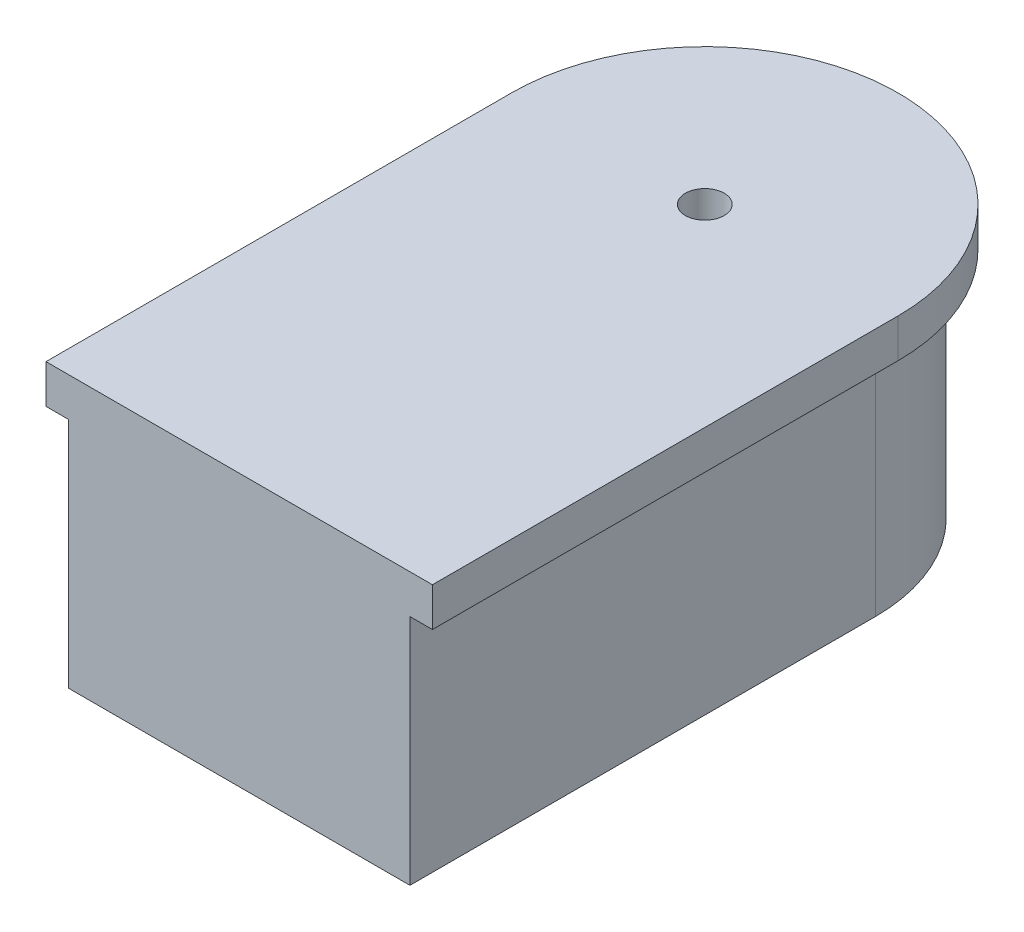
ISO-10303-21;
HEADER;
FILE_DESCRIPTION(('STEP AP214'),'2;1');
FILE_NAME('part.step','',(''),(''),'','','');
FILE_SCHEMA(('AUTOMOTIVE_DESIGN { 1 0 10303 214 1 1 1 1 }'));
ENDSEC;
DATA;
#1=APPLICATION_CONTEXT('core data for automotive mechanical design processes');
#2=APPLICATION_PROTOCOL_DEFINITION('international standard','automotive_design',2000,#1);
#3=PRODUCT_CONTEXT('',#1,'mechanical');
#4=PRODUCT('Part','Part','',(#3));
#5=PRODUCT_RELATED_PRODUCT_CATEGORY('part','',(#4));
#6=PRODUCT_DEFINITION_FORMATION('','',#4);
#7=PRODUCT_DEFINITION_CONTEXT('part definition',#1,'design');
#8=PRODUCT_DEFINITION('design','',#6,#7);
#9=PRODUCT_DEFINITION_SHAPE('','',#8);
#10=(LENGTH_UNIT() NAMED_UNIT(*) SI_UNIT(.MILLI.,.METRE.));
#11=(NAMED_UNIT(*) PLANE_ANGLE_UNIT() SI_UNIT($,.RADIAN.));
#12=(NAMED_UNIT(*) SI_UNIT($,.STERADIAN.) SOLID_ANGLE_UNIT());
#13=UNCERTAINTY_MEASURE_WITH_UNIT(LENGTH_MEASURE(1.E-05),#10,'distance_accuracy_value','');
#14=(GEOMETRIC_REPRESENTATION_CONTEXT(3) GLOBAL_UNCERTAINTY_ASSIGNED_CONTEXT((#13)) GLOBAL_UNIT_ASSIGNED_CONTEXT((#10,
#11,#12)) REPRESENTATION_CONTEXT('',''));
#15=CARTESIAN_POINT('',(0.,0.,0.));
#16=DIRECTION('',(0.,0.,1.));
#17=DIRECTION('',(1.,0.,0.));
#18=AXIS2_PLACEMENT_3D('',#15,#16,#17);
#19=CARTESIAN_POINT('',(0.,30.,0.));
#20=DIRECTION('',(1.,0.,0.));
#21=DIRECTION('',(0.,0.,-1.));
#22=AXIS2_PLACEMENT_3D('',#19,#20,#21);
#23=PLANE('',#22);
#24=DIRECTION('',(0.,0.,1.));
#25=VECTOR('',#24,1.);
#26=CARTESIAN_POINT('',(0.,0.,0.));
#27=LINE('',#26,#25);
#28=CARTESIAN_POINT('',(0.,0.,-60.));
#29=VERTEX_POINT('',#28);
#30=CARTESIAN_POINT('',(0.,0.,0.));
#31=VERTEX_POINT('',#30);
#32=EDGE_CURVE('E130',#29,#31,#27,.T.);
#33=ORIENTED_EDGE('',*,*,#32,.T.);
#34=DIRECTION('',(0.,-1.,0.));
#35=VECTOR('',#34,1.);
#36=CARTESIAN_POINT('',(0.,30.,0.));
#37=LINE('',#36,#35);
#38=CARTESIAN_POINT('',(0.,30.,0.));
#39=VERTEX_POINT('',#38);
#40=EDGE_CURVE('E11',#39,#31,#37,.T.);
#41=ORIENTED_EDGE('',*,*,#40,.F.);
#42=DIRECTION('',(0.,0.,1.));
#43=VECTOR('',#42,1.);
#44=CARTESIAN_POINT('',(0.,30.,0.));
#45=LINE('',#44,#43);
#46=CARTESIAN_POINT('',(0.,30.,-60.));
#47=VERTEX_POINT('',#46);
#48=EDGE_CURVE('E138',#47,#39,#45,.T.);
#49=ORIENTED_EDGE('',*,*,#48,.F.);
#50=DIRECTION('',(0.,-1.,0.));
#51=VECTOR('',#50,1.);
#52=CARTESIAN_POINT('',(0.,30.,-60.));
#53=LINE('',#52,#51);
#54=EDGE_CURVE('E145',#47,#29,#53,.T.);
#55=ORIENTED_EDGE('',*,*,#54,.T.);
#56=EDGE_LOOP('',(#33,#41,#49,#55));
#57=FACE_BOUND('',#56,.T.);
#58=ADVANCED_FACE('F33',(#57),#23,.F.);
#59=CARTESIAN_POINT('',(0.,30.,0.));
#60=DIRECTION('',(0.,0.,-1.));
#61=DIRECTION('',(-1.,0.,0.));
#62=AXIS2_PLACEMENT_3D('',#59,#60,#61);
#63=PLANE('',#62);
#64=DIRECTION('',(1.,0.,0.));
#65=VECTOR('',#64,1.);
#66=CARTESIAN_POINT('',(0.,0.,0.));
#67=LINE('',#66,#65);
#68=CARTESIAN_POINT('',(44.,0.,0.));
#69=VERTEX_POINT('',#68);
#70=EDGE_CURVE('E132',#31,#69,#67,.T.);
#71=ORIENTED_EDGE('',*,*,#70,.T.);
#72=DIRECTION('',(0.,-1.,0.));
#73=VECTOR('',#72,1.);
#74=CARTESIAN_POINT('',(44.,30.,0.));
#75=LINE('',#74,#73);
#76=CARTESIAN_POINT('',(44.,30.,0.));
#77=VERTEX_POINT('',#76);
#78=EDGE_CURVE('E41',#77,#69,#75,.T.);
#79=ORIENTED_EDGE('',*,*,#78,.F.);
#80=DIRECTION('',(1.,0.,0.));
#81=VECTOR('',#80,1.);
#82=CARTESIAN_POINT('',(46.9,30.,0.));
#83=LINE('',#82,#81);
#84=CARTESIAN_POINT('',(46.9,30.,0.));
#85=VERTEX_POINT('',#84);
#86=EDGE_CURVE('E162',#77,#85,#83,.T.);
#87=ORIENTED_EDGE('',*,*,#86,.T.);
#88=DIRECTION('',(0.,-1.,0.));
#89=VECTOR('',#88,1.);
#90=CARTESIAN_POINT('',(46.9,35.,0.));
#91=LINE('',#90,#89);
#92=CARTESIAN_POINT('',(46.9,35.,0.));
#93=VERTEX_POINT('',#92);
#94=EDGE_CURVE('E169',#93,#85,#91,.T.);
#95=ORIENTED_EDGE('',*,*,#94,.F.);
#96=DIRECTION('',(1.,0.,0.));
#97=VECTOR('',#96,1.);
#98=CARTESIAN_POINT('',(46.9,35.,0.));
#99=LINE('',#98,#97);
#100=CARTESIAN_POINT('',(-2.89999999999999,35.,0.));
#101=VERTEX_POINT('',#100);
#102=EDGE_CURVE('E121',#101,#93,#99,.T.);
#103=ORIENTED_EDGE('',*,*,#102,.F.);
#104=DIRECTION('',(0.,-1.,0.));
#105=VECTOR('',#104,1.);
#106=CARTESIAN_POINT('',(-2.89999999999999,35.,0.));
#107=LINE('',#106,#105);
#108=CARTESIAN_POINT('',(-2.89999999999999,30.,0.));
#109=VERTEX_POINT('',#108);
#110=EDGE_CURVE('E134',#101,#109,#107,.T.);
#111=ORIENTED_EDGE('',*,*,#110,.T.);
#112=EDGE_CURVE('E125',#109,#39,#83,.T.);
#113=ORIENTED_EDGE('',*,*,#112,.T.);
#114=ORIENTED_EDGE('',*,*,#40,.T.);
#115=EDGE_LOOP('',(#71,#79,#87,#95,#103,#111,#113,#114));
#116=FACE_BOUND('',#115,.T.);
#117=ADVANCED_FACE('F172',(#116),#63,.F.);
#118=CARTESIAN_POINT('',(44.,30.,0.));
#119=DIRECTION('',(-1.,0.,0.));
#120=DIRECTION('',(0.,0.,1.));
#121=AXIS2_PLACEMENT_3D('',#118,#119,#120);
#122=PLANE('',#121);
#123=DIRECTION('',(0.,0.,-1.));
#124=VECTOR('',#123,1.);
#125=CARTESIAN_POINT('',(44.,0.,0.));
#126=LINE('',#125,#124);
#127=CARTESIAN_POINT('',(44.,0.,-60.));
#128=VERTEX_POINT('',#127);
#129=EDGE_CURVE('E65',#69,#128,#126,.T.);
#130=ORIENTED_EDGE('',*,*,#129,.T.);
#131=DIRECTION('',(0.,-1.,0.));
#132=VECTOR('',#131,1.);
#133=CARTESIAN_POINT('',(44.,30.,-60.));
#134=LINE('',#133,#132);
#135=CARTESIAN_POINT('',(44.,30.,-60.));
#136=VERTEX_POINT('',#135);
#137=EDGE_CURVE('E49',#136,#128,#134,.T.);
#138=ORIENTED_EDGE('',*,*,#137,.F.);
#139=DIRECTION('',(0.,0.,-1.));
#140=VECTOR('',#139,1.);
#141=CARTESIAN_POINT('',(44.,30.,0.));
#142=LINE('',#141,#140);
#143=EDGE_CURVE('E140',#77,#136,#142,.T.);
#144=ORIENTED_EDGE('',*,*,#143,.F.);
#145=ORIENTED_EDGE('',*,*,#78,.T.);
#146=EDGE_LOOP('',(#130,#138,#144,#145));
#147=FACE_BOUND('',#146,.T.);
#148=ADVANCED_FACE('F151',(#147),#122,.F.);
#149=CARTESIAN_POINT('',(22.,30.,-60.));
#150=DIRECTION('',(0.,-1.,0.));
#151=DIRECTION('',(0.,0.,-1.));
#152=AXIS2_PLACEMENT_3D('',#149,#150,#151);
#153=CYLINDRICAL_SURFACE('',#152,22.);
#154=CARTESIAN_POINT('',(22.,0.,-60.));
#155=DIRECTION('',(0.,1.,0.));
#156=DIRECTION('',(0.,0.,-1.));
#157=AXIS2_PLACEMENT_3D('',#154,#155,#156);
#158=CIRCLE('',#157,22.);
#159=EDGE_CURVE('E70',#128,#29,#158,.T.);
#160=ORIENTED_EDGE('',*,*,#159,.T.);
#161=ORIENTED_EDGE('',*,*,#54,.F.);
#162=CARTESIAN_POINT('',(22.,30.,-60.));
#163=DIRECTION('',(0.,1.,0.));
#164=DIRECTION('',(0.,0.,-1.));
#165=AXIS2_PLACEMENT_3D('',#162,#163,#164);
#166=CIRCLE('',#165,22.);
#167=EDGE_CURVE('E143',#136,#47,#166,.T.);
#168=ORIENTED_EDGE('',*,*,#167,.F.);
#169=ORIENTED_EDGE('',*,*,#137,.T.);
#170=EDGE_LOOP('',(#160,#161,#168,#169));
#171=FACE_BOUND('',#170,.T.);
#172=ADVANCED_FACE('F157',(#171),#153,.T.);
#173=CARTESIAN_POINT('',(22.,0.,-60.));
#174=DIRECTION('',(0.,-1.,0.));
#175=DIRECTION('',(0.,0.,-1.));
#176=AXIS2_PLACEMENT_3D('',#173,#174,#175);
#177=PLANE('',#176);
#178=CARTESIAN_POINT('',(22.,0.,-60.));
#179=DIRECTION('',(0.,1.,0.));
#180=DIRECTION('',(0.,0.,1.));
#181=AXIS2_PLACEMENT_3D('',#178,#179,#180);
#182=CIRCLE('',#181,2.5);
#183=CARTESIAN_POINT('',(22.,0.,-57.5));
#184=VERTEX_POINT('',#183);
#185=EDGE_CURVE('E179',#184,#184,#182,.T.);
#186=ORIENTED_EDGE('',*,*,#185,.T.);
#187=EDGE_LOOP('',(#186));
#188=FACE_BOUND('',#187,.T.);
#189=ORIENTED_EDGE('',*,*,#32,.F.);
#190=ORIENTED_EDGE('',*,*,#159,.F.);
#191=ORIENTED_EDGE('',*,*,#129,.F.);
#192=ORIENTED_EDGE('',*,*,#70,.F.);
#193=EDGE_LOOP('',(#189,#190,#191,#192));
#194=FACE_BOUND('',#193,.T.);
#195=ADVANCED_FACE('F156',(#188,#194),#177,.T.);
#196=CARTESIAN_POINT('',(46.9,35.,0.));
#197=DIRECTION('',(-1.,0.,0.));
#198=DIRECTION('',(0.,0.,1.));
#199=AXIS2_PLACEMENT_3D('',#196,#197,#198);
#200=PLANE('',#199);
#201=DIRECTION('',(0.,0.,-1.));
#202=VECTOR('',#201,1.);
#203=CARTESIAN_POINT('',(46.9,30.,0.));
#204=LINE('',#203,#202);
#205=CARTESIAN_POINT('',(46.9,30.,-60.));
#206=VERTEX_POINT('',#205);
#207=EDGE_CURVE('E129',#85,#206,#204,.T.);
#208=ORIENTED_EDGE('',*,*,#207,.T.);
#209=DIRECTION('',(0.,-1.,0.));
#210=VECTOR('',#209,1.);
#211=CARTESIAN_POINT('',(46.9,35.,-60.));
#212=LINE('',#211,#210);
#213=CARTESIAN_POINT('',(46.9,35.,-60.));
#214=VERTEX_POINT('',#213);
#215=EDGE_CURVE('E109',#214,#206,#212,.T.);
#216=ORIENTED_EDGE('',*,*,#215,.F.);
#217=DIRECTION('',(0.,0.,-1.));
#218=VECTOR('',#217,1.);
#219=CARTESIAN_POINT('',(46.9,35.,0.));
#220=LINE('',#219,#218);
#221=EDGE_CURVE('E116',#93,#214,#220,.T.);
#222=ORIENTED_EDGE('',*,*,#221,.F.);
#223=ORIENTED_EDGE('',*,*,#94,.T.);
#224=EDGE_LOOP('',(#208,#216,#222,#223));
#225=FACE_BOUND('',#224,.T.);
#226=ADVANCED_FACE('F127',(#225),#200,.F.);
#227=CARTESIAN_POINT('',(22.,35.,-60.));
#228=DIRECTION('',(0.,-1.,0.));
#229=DIRECTION('',(0.,0.,-1.));
#230=AXIS2_PLACEMENT_3D('',#227,#228,#229);
#231=CYLINDRICAL_SURFACE('',#230,24.9);
#232=CARTESIAN_POINT('',(22.,30.,-60.));
#233=DIRECTION('',(0.,1.,0.));
#234=DIRECTION('',(0.,0.,-1.));
#235=AXIS2_PLACEMENT_3D('',#232,#233,#234);
#236=CIRCLE('',#235,24.9);
#237=CARTESIAN_POINT('',(-2.89999999999999,30.,-60.));
#238=VERTEX_POINT('',#237);
#239=EDGE_CURVE('E165',#206,#238,#236,.T.);
#240=ORIENTED_EDGE('',*,*,#239,.T.);
#241=DIRECTION('',(0.,-1.,0.));
#242=VECTOR('',#241,1.);
#243=CARTESIAN_POINT('',(-2.89999999999999,35.,-60.));
#244=LINE('',#243,#242);
#245=CARTESIAN_POINT('',(-2.89999999999999,35.,-60.));
#246=VERTEX_POINT('',#245);
#247=EDGE_CURVE('E112',#246,#238,#244,.T.);
#248=ORIENTED_EDGE('',*,*,#247,.F.);
#249=CARTESIAN_POINT('',(22.,35.,-60.));
#250=DIRECTION('',(0.,1.,0.));
#251=DIRECTION('',(0.,0.,-1.));
#252=AXIS2_PLACEMENT_3D('',#249,#250,#251);
#253=CIRCLE('',#252,24.9);
#254=EDGE_CURVE('E105',#214,#246,#253,.T.);
#255=ORIENTED_EDGE('',*,*,#254,.F.);
#256=ORIENTED_EDGE('',*,*,#215,.T.);
#257=EDGE_LOOP('',(#240,#248,#255,#256));
#258=FACE_BOUND('',#257,.T.);
#259=ADVANCED_FACE('F107',(#258),#231,.T.);
#260=CARTESIAN_POINT('',(-2.89999999999999,35.,0.));
#261=DIRECTION('',(1.,0.,0.));
#262=DIRECTION('',(0.,0.,-1.));
#263=AXIS2_PLACEMENT_3D('',#260,#261,#262);
#264=PLANE('',#263);
#265=DIRECTION('',(0.,0.,1.));
#266=VECTOR('',#265,1.);
#267=CARTESIAN_POINT('',(-2.89999999999999,30.,0.));
#268=LINE('',#267,#266);
#269=EDGE_CURVE('E163',#238,#109,#268,.T.);
#270=ORIENTED_EDGE('',*,*,#269,.T.);
#271=ORIENTED_EDGE('',*,*,#110,.F.);
#272=DIRECTION('',(0.,0.,1.));
#273=VECTOR('',#272,1.);
#274=CARTESIAN_POINT('',(-2.89999999999999,35.,0.));
#275=LINE('',#274,#273);
#276=EDGE_CURVE('E115',#246,#101,#275,.T.);
#277=ORIENTED_EDGE('',*,*,#276,.F.);
#278=ORIENTED_EDGE('',*,*,#247,.T.);
#279=EDGE_LOOP('',(#270,#271,#277,#278));
#280=FACE_BOUND('',#279,.T.);
#281=ADVANCED_FACE('F175',(#280),#264,.F.);
#282=CARTESIAN_POINT('',(22.,35.,-60.));
#283=DIRECTION('',(0.,-1.,0.));
#284=DIRECTION('',(0.,0.,-1.));
#285=AXIS2_PLACEMENT_3D('',#282,#283,#284);
#286=PLANE('',#285);
#287=CARTESIAN_POINT('',(22.,35.,-60.));
#288=DIRECTION('',(0.,1.,0.));
#289=DIRECTION('',(0.,0.,1.));
#290=AXIS2_PLACEMENT_3D('',#287,#288,#289);
#291=CIRCLE('',#290,2.5);
#292=CARTESIAN_POINT('',(22.,35.,-57.5));
#293=VERTEX_POINT('',#292);
#294=EDGE_CURVE('E181',#293,#293,#291,.T.);
#295=ORIENTED_EDGE('',*,*,#294,.F.);
#296=EDGE_LOOP('',(#295));
#297=FACE_BOUND('',#296,.T.);
#298=ORIENTED_EDGE('',*,*,#221,.T.);
#299=ORIENTED_EDGE('',*,*,#254,.T.);
#300=ORIENTED_EDGE('',*,*,#276,.T.);
#301=ORIENTED_EDGE('',*,*,#102,.T.);
#302=EDGE_LOOP('',(#298,#299,#300,#301));
#303=FACE_BOUND('',#302,.T.);
#304=ADVANCED_FACE('F119',(#297,#303),#286,.F.);
#305=CARTESIAN_POINT('',(22.,30.,-60.));
#306=DIRECTION('',(0.,-1.,0.));
#307=DIRECTION('',(0.,0.,-1.));
#308=AXIS2_PLACEMENT_3D('',#305,#306,#307);
#309=PLANE('',#308);
#310=ORIENTED_EDGE('',*,*,#167,.T.);
#311=ORIENTED_EDGE('',*,*,#48,.T.);
#312=ORIENTED_EDGE('',*,*,#112,.F.);
#313=ORIENTED_EDGE('',*,*,#269,.F.);
#314=ORIENTED_EDGE('',*,*,#239,.F.);
#315=ORIENTED_EDGE('',*,*,#207,.F.);
#316=ORIENTED_EDGE('',*,*,#86,.F.);
#317=ORIENTED_EDGE('',*,*,#143,.T.);
#318=EDGE_LOOP('',(#310,#311,#312,#313,#314,#315,#316,#317));
#319=FACE_BOUND('',#318,.T.);
#320=ADVANCED_FACE('F159',(#319),#309,.T.);
#321=CARTESIAN_POINT('',(22.,0.,-60.));
#322=DIRECTION('',(0.,1.,0.));
#323=DIRECTION('',(0.,0.,1.));
#324=AXIS2_PLACEMENT_3D('',#321,#322,#323);
#325=CYLINDRICAL_SURFACE('',#324,2.5);
#326=ORIENTED_EDGE('',*,*,#185,.F.);
#327=EDGE_LOOP('',(#326));
#328=FACE_BOUND('',#327,.T.);
#329=ORIENTED_EDGE('',*,*,#294,.T.);
#330=EDGE_LOOP('',(#329));
#331=FACE_BOUND('',#330,.T.);
#332=ADVANCED_FACE('F189',(#328,#331),#325,.F.);
#333=CLOSED_SHELL('',(#58,#117,#148,#172,#195,#226,#259,#281,#304,#320,#332));
#334=MANIFOLD_SOLID_BREP('B2',#333);
#335=ADVANCED_BREP_SHAPE_REPRESENTATION('',(#18,#334),#14);
#336=SHAPE_DEFINITION_REPRESENTATION(#9,#335);
ENDSEC;
END-ISO-10303-21;
